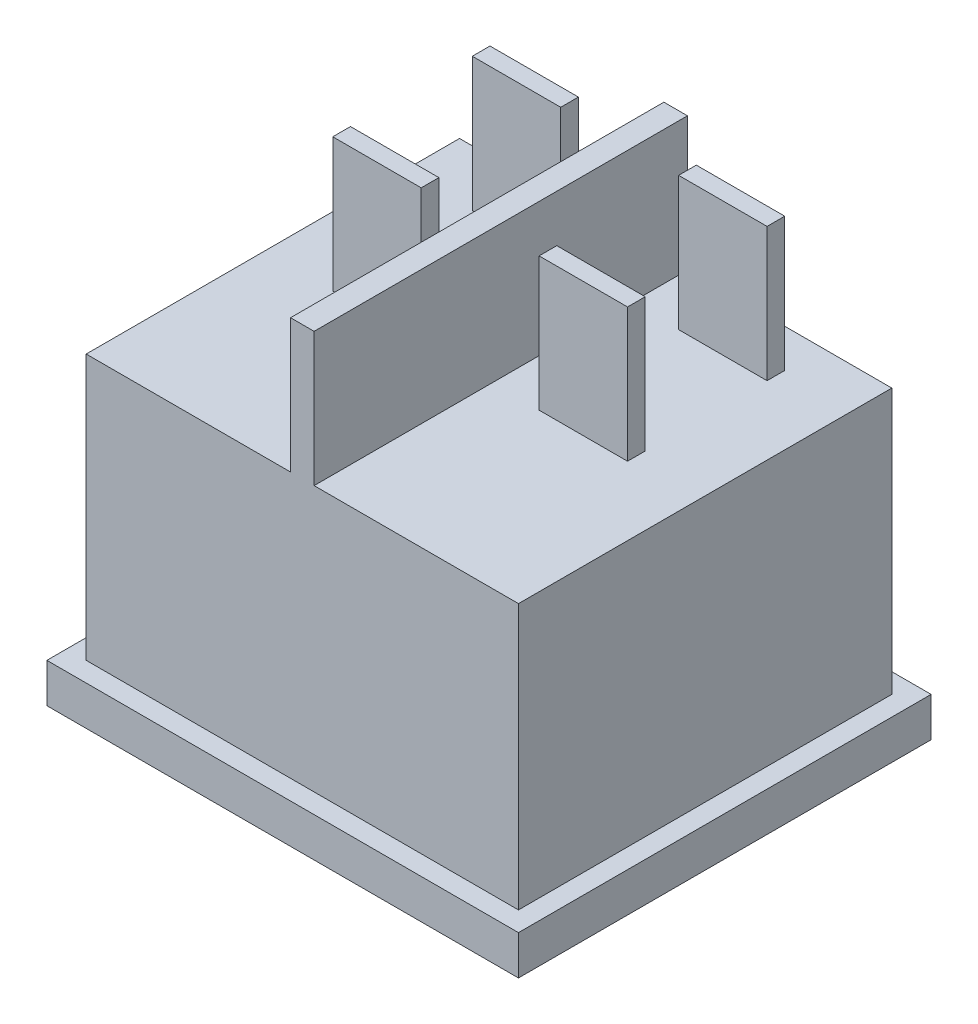
ISO-10303-21;
HEADER;
FILE_DESCRIPTION(('STEP AP214'),'2;1');
FILE_NAME('part.step','',(''),(''),'','','');
FILE_SCHEMA(('AUTOMOTIVE_DESIGN { 1 0 10303 214 1 1 1 1 }'));
ENDSEC;
DATA;
#1=APPLICATION_CONTEXT('core data for automotive mechanical design processes');
#2=APPLICATION_PROTOCOL_DEFINITION('international standard','automotive_design',2000,#1);
#3=PRODUCT_CONTEXT('',#1,'mechanical');
#4=PRODUCT('Part','Part','',(#3));
#5=PRODUCT_RELATED_PRODUCT_CATEGORY('part','',(#4));
#6=PRODUCT_DEFINITION_FORMATION('','',#4);
#7=PRODUCT_DEFINITION_CONTEXT('part definition',#1,'design');
#8=PRODUCT_DEFINITION('design','',#6,#7);
#9=PRODUCT_DEFINITION_SHAPE('','',#8);
#10=(LENGTH_UNIT() NAMED_UNIT(*) SI_UNIT(.MILLI.,.METRE.));
#11=(NAMED_UNIT(*) PLANE_ANGLE_UNIT() SI_UNIT($,.RADIAN.));
#12=(NAMED_UNIT(*) SI_UNIT($,.STERADIAN.) SOLID_ANGLE_UNIT());
#13=UNCERTAINTY_MEASURE_WITH_UNIT(LENGTH_MEASURE(1.E-05),#10,'distance_accuracy_value','');
#14=(GEOMETRIC_REPRESENTATION_CONTEXT(3) GLOBAL_UNCERTAINTY_ASSIGNED_CONTEXT((#13)) GLOBAL_UNIT_ASSIGNED_CONTEXT((#10,
#11,#12)) REPRESENTATION_CONTEXT('',''));
#15=CARTESIAN_POINT('',(0.,0.,0.));
#16=DIRECTION('',(0.,0.,1.));
#17=DIRECTION('',(1.,0.,0.));
#18=AXIS2_PLACEMENT_3D('',#15,#16,#17);
#19=CARTESIAN_POINT('',(0.,15.5,0.));
#20=DIRECTION('',(0.,-1.,0.));
#21=DIRECTION('',(0.,0.,-1.));
#22=AXIS2_PLACEMENT_3D('',#19,#20,#21);
#23=PLANE('',#22);
#24=DIRECTION('',(1.,0.,0.));
#25=VECTOR('',#24,1.);
#26=CARTESIAN_POINT('',(3.,15.5,-6.65));
#27=LINE('',#26,#25);
#28=CARTESIAN_POINT('',(3.,15.5,-6.65));
#29=VERTEX_POINT('',#28);
#30=CARTESIAN_POINT('',(7.5,15.5,-6.65));
#31=VERTEX_POINT('',#30);
#32=EDGE_CURVE('E272',#29,#31,#27,.T.);
#33=ORIENTED_EDGE('',*,*,#32,.F.);
#34=DIRECTION('',(0.,0.,1.));
#35=VECTOR('',#34,1.);
#36=CARTESIAN_POINT('',(3.,15.5,-6.65));
#37=LINE('',#36,#35);
#38=CARTESIAN_POINT('',(3.,15.5,-7.55));
#39=VERTEX_POINT('',#38);
#40=EDGE_CURVE('E269',#39,#29,#37,.T.);
#41=ORIENTED_EDGE('',*,*,#40,.F.);
#42=DIRECTION('',(-1.,0.,0.));
#43=VECTOR('',#42,1.);
#44=CARTESIAN_POINT('',(3.,15.5,-7.55));
#45=LINE('',#44,#43);
#46=CARTESIAN_POINT('',(7.5,15.5,-7.55));
#47=VERTEX_POINT('',#46);
#48=EDGE_CURVE('E266',#47,#39,#45,.T.);
#49=ORIENTED_EDGE('',*,*,#48,.F.);
#50=DIRECTION('',(0.,0.,-1.));
#51=VECTOR('',#50,1.);
#52=CARTESIAN_POINT('',(7.5,15.5,-6.65));
#53=LINE('',#52,#51);
#54=EDGE_CURVE('E263',#31,#47,#53,.T.);
#55=ORIENTED_EDGE('',*,*,#54,.F.);
#56=EDGE_LOOP('',(#33,#41,#49,#55));
#57=FACE_BOUND('',#56,.T.);
#58=DIRECTION('',(0.,0.,-1.));
#59=VECTOR('',#58,1.);
#60=CARTESIAN_POINT('',(0.6,15.5,9.5));
#61=LINE('',#60,#59);
#62=CARTESIAN_POINT('',(0.6,15.5,9.5));
#63=VERTEX_POINT('',#62);
#64=CARTESIAN_POINT('',(0.6,15.5,-9.5));
#65=VERTEX_POINT('',#64);
#66=EDGE_CURVE('E335',#63,#65,#61,.T.);
#67=ORIENTED_EDGE('',*,*,#66,.F.);
#68=DIRECTION('',(1.,0.,0.));
#69=VECTOR('',#68,1.);
#70=CARTESIAN_POINT('',(-11.,15.5,9.5));
#71=LINE('',#70,#69);
#72=CARTESIAN_POINT('',(11.,15.5,9.5));
#73=VERTEX_POINT('',#72);
#74=EDGE_CURVE('E397',#63,#73,#71,.T.);
#75=ORIENTED_EDGE('',*,*,#74,.T.);
#76=DIRECTION('',(0.,0.,-1.));
#77=VECTOR('',#76,1.);
#78=CARTESIAN_POINT('',(11.,15.5,9.5));
#79=LINE('',#78,#77);
#80=CARTESIAN_POINT('',(11.,15.5,-9.5));
#81=VERTEX_POINT('',#80);
#82=EDGE_CURVE('E388',#73,#81,#79,.T.);
#83=ORIENTED_EDGE('',*,*,#82,.T.);
#84=DIRECTION('',(-1.,0.,0.));
#85=VECTOR('',#84,1.);
#86=CARTESIAN_POINT('',(-11.,15.5,-9.5));
#87=LINE('',#86,#85);
#88=EDGE_CURVE('E393',#81,#65,#87,.T.);
#89=ORIENTED_EDGE('',*,*,#88,.T.);
#90=EDGE_LOOP('',(#67,#75,#83,#89));
#91=FACE_BOUND('',#90,.T.);
#92=DIRECTION('',(1.,0.,0.));
#93=VECTOR('',#92,1.);
#94=CARTESIAN_POINT('',(3.,15.5,0.45));
#95=LINE('',#94,#93);
#96=CARTESIAN_POINT('',(3.,15.5,0.45));
#97=VERTEX_POINT('',#96);
#98=CARTESIAN_POINT('',(7.5,15.5,0.45));
#99=VERTEX_POINT('',#98);
#100=EDGE_CURVE('E50',#97,#99,#95,.T.);
#101=ORIENTED_EDGE('',*,*,#100,.F.);
#102=DIRECTION('',(0.,0.,1.));
#103=VECTOR('',#102,1.);
#104=CARTESIAN_POINT('',(3.,15.5,0.45));
#105=LINE('',#104,#103);
#106=CARTESIAN_POINT('',(3.,15.5,-0.45));
#107=VERTEX_POINT('',#106);
#108=EDGE_CURVE('E55',#107,#97,#105,.T.);
#109=ORIENTED_EDGE('',*,*,#108,.F.);
#110=DIRECTION('',(-1.,0.,0.));
#111=VECTOR('',#110,1.);
#112=CARTESIAN_POINT('',(3.,15.5,-0.45));
#113=LINE('',#112,#111);
#114=CARTESIAN_POINT('',(7.5,15.5,-0.45));
#115=VERTEX_POINT('',#114);
#116=EDGE_CURVE('E217',#115,#107,#113,.T.);
#117=ORIENTED_EDGE('',*,*,#116,.F.);
#118=DIRECTION('',(0.,0.,-1.));
#119=VECTOR('',#118,1.);
#120=CARTESIAN_POINT('',(7.5,15.5,0.45));
#121=LINE('',#120,#119);
#122=EDGE_CURVE('E220',#99,#115,#121,.T.);
#123=ORIENTED_EDGE('',*,*,#122,.F.);
#124=EDGE_LOOP('',(#101,#109,#117,#123));
#125=FACE_BOUND('',#124,.T.);
#126=ADVANCED_FACE('F35',(#57,#91,#125),#23,.F.);
#127=DIRECTION('',(1.,0.,0.));
#128=VECTOR('',#127,1.);
#129=CARTESIAN_POINT('',(-7.5,15.5,-6.65));
#130=LINE('',#129,#128);
#131=CARTESIAN_POINT('',(-7.5,15.5,-6.65));
#132=VERTEX_POINT('',#131);
#133=CARTESIAN_POINT('',(-3.,15.5,-6.65));
#134=VERTEX_POINT('',#133);
#135=EDGE_CURVE('E344',#132,#134,#130,.T.);
#136=ORIENTED_EDGE('',*,*,#135,.F.);
#137=DIRECTION('',(0.,0.,1.));
#138=VECTOR('',#137,1.);
#139=CARTESIAN_POINT('',(-7.5,15.5,-6.65));
#140=LINE('',#139,#138);
#141=CARTESIAN_POINT('',(-7.5,15.5,-7.55));
#142=VERTEX_POINT('',#141);
#143=EDGE_CURVE('E341',#142,#132,#140,.T.);
#144=ORIENTED_EDGE('',*,*,#143,.F.);
#145=DIRECTION('',(-1.,0.,0.));
#146=VECTOR('',#145,1.);
#147=CARTESIAN_POINT('',(-7.5,15.5,-7.55));
#148=LINE('',#147,#146);
#149=CARTESIAN_POINT('',(-3.,15.5,-7.55));
#150=VERTEX_POINT('',#149);
#151=EDGE_CURVE('E338',#150,#142,#148,.T.);
#152=ORIENTED_EDGE('',*,*,#151,.F.);
#153=DIRECTION('',(0.,0.,-1.));
#154=VECTOR('',#153,1.);
#155=CARTESIAN_POINT('',(-3.,15.5,-6.65));
#156=LINE('',#155,#154);
#157=EDGE_CURVE('E299',#134,#150,#156,.T.);
#158=ORIENTED_EDGE('',*,*,#157,.F.);
#159=EDGE_LOOP('',(#136,#144,#152,#158));
#160=FACE_BOUND('',#159,.T.);
#161=DIRECTION('',(0.,0.,1.));
#162=VECTOR('',#161,1.);
#163=CARTESIAN_POINT('',(-0.6,15.5,9.5));
#164=LINE('',#163,#162);
#165=CARTESIAN_POINT('',(-0.6,15.5,-9.5));
#166=VERTEX_POINT('',#165);
#167=CARTESIAN_POINT('',(-0.6,15.5,9.5));
#168=VERTEX_POINT('',#167);
#169=EDGE_CURVE('E365',#166,#168,#164,.T.);
#170=ORIENTED_EDGE('',*,*,#169,.F.);
#171=CARTESIAN_POINT('',(-11.,15.5,-9.5));
#172=VERTEX_POINT('',#171);
#173=EDGE_CURVE('E391',#166,#172,#87,.T.);
#174=ORIENTED_EDGE('',*,*,#173,.T.);
#175=DIRECTION('',(0.,0.,1.));
#176=VECTOR('',#175,1.);
#177=CARTESIAN_POINT('',(-11.,15.5,9.5));
#178=LINE('',#177,#176);
#179=CARTESIAN_POINT('',(-11.,15.5,9.5));
#180=VERTEX_POINT('',#179);
#181=EDGE_CURVE('E395',#172,#180,#178,.T.);
#182=ORIENTED_EDGE('',*,*,#181,.T.);
#183=EDGE_CURVE('E398',#180,#168,#71,.T.);
#184=ORIENTED_EDGE('',*,*,#183,.T.);
#185=EDGE_LOOP('',(#170,#174,#182,#184));
#186=FACE_BOUND('',#185,.T.);
#187=DIRECTION('',(1.,0.,0.));
#188=VECTOR('',#187,1.);
#189=CARTESIAN_POINT('',(-7.5,15.5,0.45));
#190=LINE('',#189,#188);
#191=CARTESIAN_POINT('',(-7.5,15.5,0.45));
#192=VERTEX_POINT('',#191);
#193=CARTESIAN_POINT('',(-3.,15.5,0.45));
#194=VERTEX_POINT('',#193);
#195=EDGE_CURVE('E308',#192,#194,#190,.T.);
#196=ORIENTED_EDGE('',*,*,#195,.F.);
#197=DIRECTION('',(0.,0.,1.));
#198=VECTOR('',#197,1.);
#199=CARTESIAN_POINT('',(-7.5,15.5,0.45));
#200=LINE('',#199,#198);
#201=CARTESIAN_POINT('',(-7.5,15.5,-0.45));
#202=VERTEX_POINT('',#201);
#203=EDGE_CURVE('E305',#202,#192,#200,.T.);
#204=ORIENTED_EDGE('',*,*,#203,.F.);
#205=DIRECTION('',(-1.,0.,0.));
#206=VECTOR('',#205,1.);
#207=CARTESIAN_POINT('',(-7.5,15.5,-0.45));
#208=LINE('',#207,#206);
#209=CARTESIAN_POINT('',(-3.,15.5,-0.45));
#210=VERTEX_POINT('',#209);
#211=EDGE_CURVE('E302',#210,#202,#208,.T.);
#212=ORIENTED_EDGE('',*,*,#211,.F.);
#213=DIRECTION('',(0.,0.,-1.));
#214=VECTOR('',#213,1.);
#215=CARTESIAN_POINT('',(-3.,15.5,0.45));
#216=LINE('',#215,#214);
#217=EDGE_CURVE('E262',#194,#210,#216,.T.);
#218=ORIENTED_EDGE('',*,*,#217,.F.);
#219=EDGE_LOOP('',(#196,#204,#212,#218));
#220=FACE_BOUND('',#219,.T.);
#221=ADVANCED_FACE('F475',(#160,#186,#220),#23,.F.);
#222=CARTESIAN_POINT('',(0.,2.,0.));
#223=DIRECTION('',(0.,-1.,0.));
#224=DIRECTION('',(0.,0.,-1.));
#225=AXIS2_PLACEMENT_3D('',#222,#223,#224);
#226=PLANE('',#225);
#227=DIRECTION('',(0.,0.,-1.));
#228=VECTOR('',#227,1.);
#229=CARTESIAN_POINT('',(12.,2.,10.5));
#230=LINE('',#229,#228);
#231=CARTESIAN_POINT('',(12.,2.,10.5));
#232=VERTEX_POINT('',#231);
#233=CARTESIAN_POINT('',(12.,2.,-10.5));
#234=VERTEX_POINT('',#233);
#235=EDGE_CURVE('E423',#232,#234,#230,.T.);
#236=ORIENTED_EDGE('',*,*,#235,.T.);
#237=DIRECTION('',(-1.,0.,0.));
#238=VECTOR('',#237,1.);
#239=CARTESIAN_POINT('',(-12.,2.,-10.5));
#240=LINE('',#239,#238);
#241=CARTESIAN_POINT('',(-12.,2.,-10.5));
#242=VERTEX_POINT('',#241);
#243=EDGE_CURVE('E426',#234,#242,#240,.T.);
#244=ORIENTED_EDGE('',*,*,#243,.T.);
#245=DIRECTION('',(0.,0.,1.));
#246=VECTOR('',#245,1.);
#247=CARTESIAN_POINT('',(-12.,2.,10.5));
#248=LINE('',#247,#246);
#249=CARTESIAN_POINT('',(-12.,2.,10.5));
#250=VERTEX_POINT('',#249);
#251=EDGE_CURVE('E429',#242,#250,#248,.T.);
#252=ORIENTED_EDGE('',*,*,#251,.T.);
#253=DIRECTION('',(1.,0.,0.));
#254=VECTOR('',#253,1.);
#255=CARTESIAN_POINT('',(-12.,2.,10.5));
#256=LINE('',#255,#254);
#257=EDGE_CURVE('E431',#250,#232,#256,.T.);
#258=ORIENTED_EDGE('',*,*,#257,.T.);
#259=EDGE_LOOP('',(#236,#244,#252,#258));
#260=FACE_BOUND('',#259,.T.);
#261=DIRECTION('',(0.,0.,-1.));
#262=VECTOR('',#261,1.);
#263=CARTESIAN_POINT('',(11.,2.,9.5));
#264=LINE('',#263,#262);
#265=CARTESIAN_POINT('',(11.,2.,9.5));
#266=VERTEX_POINT('',#265);
#267=CARTESIAN_POINT('',(11.,2.,-9.5));
#268=VERTEX_POINT('',#267);
#269=EDGE_CURVE('E387',#266,#268,#264,.T.);
#270=ORIENTED_EDGE('',*,*,#269,.F.);
#271=DIRECTION('',(1.,0.,0.));
#272=VECTOR('',#271,1.);
#273=CARTESIAN_POINT('',(-11.,2.,9.5));
#274=LINE('',#273,#272);
#275=CARTESIAN_POINT('',(-11.,2.,9.5));
#276=VERTEX_POINT('',#275);
#277=EDGE_CURVE('E392',#276,#266,#274,.T.);
#278=ORIENTED_EDGE('',*,*,#277,.F.);
#279=DIRECTION('',(0.,0.,1.));
#280=VECTOR('',#279,1.);
#281=CARTESIAN_POINT('',(-11.,2.,9.5));
#282=LINE('',#281,#280);
#283=CARTESIAN_POINT('',(-11.,2.,-9.5));
#284=VERTEX_POINT('',#283);
#285=EDGE_CURVE('E406',#284,#276,#282,.T.);
#286=ORIENTED_EDGE('',*,*,#285,.F.);
#287=DIRECTION('',(-1.,0.,0.));
#288=VECTOR('',#287,1.);
#289=CARTESIAN_POINT('',(-11.,2.,-9.5));
#290=LINE('',#289,#288);
#291=EDGE_CURVE('E403',#268,#284,#290,.T.);
#292=ORIENTED_EDGE('',*,*,#291,.F.);
#293=EDGE_LOOP('',(#270,#278,#286,#292));
#294=FACE_BOUND('',#293,.T.);
#295=ADVANCED_FACE('F465',(#260,#294),#226,.F.);
#296=CARTESIAN_POINT('',(12.,2.,10.5));
#297=DIRECTION('',(-1.,0.,0.));
#298=DIRECTION('',(0.,0.,1.));
#299=AXIS2_PLACEMENT_3D('',#296,#297,#298);
#300=PLANE('',#299);
#301=DIRECTION('',(0.,0.,-1.));
#302=VECTOR('',#301,1.);
#303=CARTESIAN_POINT('',(12.,0.,10.5));
#304=LINE('',#303,#302);
#305=CARTESIAN_POINT('',(12.,0.,10.5));
#306=VERTEX_POINT('',#305);
#307=CARTESIAN_POINT('',(12.,0.,-10.5));
#308=VERTEX_POINT('',#307);
#309=EDGE_CURVE('E422',#306,#308,#304,.T.);
#310=ORIENTED_EDGE('',*,*,#309,.T.);
#311=DIRECTION('',(0.,-1.,0.));
#312=VECTOR('',#311,1.);
#313=CARTESIAN_POINT('',(12.,2.,-10.5));
#314=LINE('',#313,#312);
#315=EDGE_CURVE('E11',#234,#308,#314,.T.);
#316=ORIENTED_EDGE('',*,*,#315,.F.);
#317=ORIENTED_EDGE('',*,*,#235,.F.);
#318=DIRECTION('',(0.,-1.,0.));
#319=VECTOR('',#318,1.);
#320=CARTESIAN_POINT('',(12.,2.,10.5));
#321=LINE('',#320,#319);
#322=EDGE_CURVE('E433',#232,#306,#321,.T.);
#323=ORIENTED_EDGE('',*,*,#322,.T.);
#324=EDGE_LOOP('',(#310,#316,#317,#323));
#325=FACE_BOUND('',#324,.T.);
#326=ADVANCED_FACE('F37',(#325),#300,.F.);
#327=CARTESIAN_POINT('',(-12.,2.,-10.5));
#328=DIRECTION('',(0.,0.,1.));
#329=DIRECTION('',(1.,0.,0.));
#330=AXIS2_PLACEMENT_3D('',#327,#328,#329);
#331=PLANE('',#330);
#332=DIRECTION('',(-1.,0.,0.));
#333=VECTOR('',#332,1.);
#334=CARTESIAN_POINT('',(-12.,0.,-10.5));
#335=LINE('',#334,#333);
#336=CARTESIAN_POINT('',(-12.,0.,-10.5));
#337=VERTEX_POINT('',#336);
#338=EDGE_CURVE('E436',#308,#337,#335,.T.);
#339=ORIENTED_EDGE('',*,*,#338,.T.);
#340=DIRECTION('',(0.,-1.,0.));
#341=VECTOR('',#340,1.);
#342=CARTESIAN_POINT('',(-12.,2.,-10.5));
#343=LINE('',#342,#341);
#344=EDGE_CURVE('E43',#242,#337,#343,.T.);
#345=ORIENTED_EDGE('',*,*,#344,.F.);
#346=ORIENTED_EDGE('',*,*,#243,.F.);
#347=ORIENTED_EDGE('',*,*,#315,.T.);
#348=EDGE_LOOP('',(#339,#345,#346,#347));
#349=FACE_BOUND('',#348,.T.);
#350=ADVANCED_FACE('F467',(#349),#331,.F.);
#351=CARTESIAN_POINT('',(-12.,2.,10.5));
#352=DIRECTION('',(1.,0.,0.));
#353=DIRECTION('',(0.,0.,-1.));
#354=AXIS2_PLACEMENT_3D('',#351,#352,#353);
#355=PLANE('',#354);
#356=DIRECTION('',(0.,0.,1.));
#357=VECTOR('',#356,1.);
#358=CARTESIAN_POINT('',(-12.,0.,10.5));
#359=LINE('',#358,#357);
#360=CARTESIAN_POINT('',(-12.,0.,10.5));
#361=VERTEX_POINT('',#360);
#362=EDGE_CURVE('E438',#337,#361,#359,.T.);
#363=ORIENTED_EDGE('',*,*,#362,.T.);
#364=DIRECTION('',(0.,-1.,0.));
#365=VECTOR('',#364,1.);
#366=CARTESIAN_POINT('',(-12.,2.,10.5));
#367=LINE('',#366,#365);
#368=EDGE_CURVE('E443',#250,#361,#367,.T.);
#369=ORIENTED_EDGE('',*,*,#368,.F.);
#370=ORIENTED_EDGE('',*,*,#251,.F.);
#371=ORIENTED_EDGE('',*,*,#344,.T.);
#372=EDGE_LOOP('',(#363,#369,#370,#371));
#373=FACE_BOUND('',#372,.T.);
#374=ADVANCED_FACE('F450',(#373),#355,.F.);
#375=CARTESIAN_POINT('',(-12.,2.,10.5));
#376=DIRECTION('',(0.,0.,-1.));
#377=DIRECTION('',(-1.,0.,0.));
#378=AXIS2_PLACEMENT_3D('',#375,#376,#377);
#379=PLANE('',#378);
#380=DIRECTION('',(1.,0.,0.));
#381=VECTOR('',#380,1.);
#382=CARTESIAN_POINT('',(-12.,0.,10.5));
#383=LINE('',#382,#381);
#384=EDGE_CURVE('E427',#361,#306,#383,.T.);
#385=ORIENTED_EDGE('',*,*,#384,.T.);
#386=ORIENTED_EDGE('',*,*,#322,.F.);
#387=ORIENTED_EDGE('',*,*,#257,.F.);
#388=ORIENTED_EDGE('',*,*,#368,.T.);
#389=EDGE_LOOP('',(#385,#386,#387,#388));
#390=FACE_BOUND('',#389,.T.);
#391=ADVANCED_FACE('F459',(#390),#379,.F.);
#392=CARTESIAN_POINT('',(0.,0.,0.));
#393=DIRECTION('',(0.,-1.,0.));
#394=DIRECTION('',(0.,0.,-1.));
#395=AXIS2_PLACEMENT_3D('',#392,#393,#394);
#396=PLANE('',#395);
#397=ORIENTED_EDGE('',*,*,#309,.F.);
#398=ORIENTED_EDGE('',*,*,#384,.F.);
#399=ORIENTED_EDGE('',*,*,#362,.F.);
#400=ORIENTED_EDGE('',*,*,#338,.F.);
#401=EDGE_LOOP('',(#397,#398,#399,#400));
#402=FACE_BOUND('',#401,.T.);
#403=ADVANCED_FACE('F456',(#402),#396,.T.);
#404=CARTESIAN_POINT('',(11.,15.5,9.5));
#405=DIRECTION('',(-1.,0.,0.));
#406=DIRECTION('',(0.,0.,1.));
#407=AXIS2_PLACEMENT_3D('',#404,#405,#406);
#408=PLANE('',#407);
#409=ORIENTED_EDGE('',*,*,#269,.T.);
#410=DIRECTION('',(0.,-1.,0.));
#411=VECTOR('',#410,1.);
#412=CARTESIAN_POINT('',(11.,15.5,-9.5));
#413=LINE('',#412,#411);
#414=EDGE_CURVE('E419',#81,#268,#413,.T.);
#415=ORIENTED_EDGE('',*,*,#414,.F.);
#416=ORIENTED_EDGE('',*,*,#82,.F.);
#417=DIRECTION('',(0.,-1.,0.));
#418=VECTOR('',#417,1.);
#419=CARTESIAN_POINT('',(11.,15.5,9.5));
#420=LINE('',#419,#418);
#421=EDGE_CURVE('E400',#73,#266,#420,.T.);
#422=ORIENTED_EDGE('',*,*,#421,.T.);
#423=EDGE_LOOP('',(#409,#415,#416,#422));
#424=FACE_BOUND('',#423,.T.);
#425=ADVANCED_FACE('F498',(#424),#408,.F.);
#426=CARTESIAN_POINT('',(-11.,15.5,-9.5));
#427=DIRECTION('',(0.,0.,1.));
#428=DIRECTION('',(1.,0.,0.));
#429=AXIS2_PLACEMENT_3D('',#426,#427,#428);
#430=PLANE('',#429);
#431=ORIENTED_EDGE('',*,*,#291,.T.);
#432=DIRECTION('',(0.,-1.,0.));
#433=VECTOR('',#432,1.);
#434=CARTESIAN_POINT('',(-11.,15.5,-9.5));
#435=LINE('',#434,#433);
#436=EDGE_CURVE('E416',#172,#284,#435,.T.);
#437=ORIENTED_EDGE('',*,*,#436,.F.);
#438=ORIENTED_EDGE('',*,*,#173,.F.);
#439=DIRECTION('',(0.,-1.,0.));
#440=VECTOR('',#439,1.);
#441=CARTESIAN_POINT('',(-0.6,22.3,-9.5));
#442=LINE('',#441,#440);
#443=CARTESIAN_POINT('',(-0.6,22.3,-9.5));
#444=VERTEX_POINT('',#443);
#445=EDGE_CURVE('E381',#444,#166,#442,.T.);
#446=ORIENTED_EDGE('',*,*,#445,.F.);
#447=DIRECTION('',(-1.,0.,0.));
#448=VECTOR('',#447,1.);
#449=CARTESIAN_POINT('',(-0.6,22.3,-9.5));
#450=LINE('',#449,#448);
#451=CARTESIAN_POINT('',(0.6,22.3,-9.5));
#452=VERTEX_POINT('',#451);
#453=EDGE_CURVE('E364',#452,#444,#450,.T.);
#454=ORIENTED_EDGE('',*,*,#453,.F.);
#455=DIRECTION('',(0.,-1.,0.));
#456=VECTOR('',#455,1.);
#457=CARTESIAN_POINT('',(0.6,22.3,-9.5));
#458=LINE('',#457,#456);
#459=EDGE_CURVE('E384',#452,#65,#458,.T.);
#460=ORIENTED_EDGE('',*,*,#459,.T.);
#461=ORIENTED_EDGE('',*,*,#88,.F.);
#462=ORIENTED_EDGE('',*,*,#414,.T.);
#463=EDGE_LOOP('',(#431,#437,#438,#446,#454,#460,#461,#462));
#464=FACE_BOUND('',#463,.T.);
#465=ADVANCED_FACE('F494',(#464),#430,.F.);
#466=CARTESIAN_POINT('',(-11.,15.5,9.5));
#467=DIRECTION('',(1.,0.,0.));
#468=DIRECTION('',(0.,0.,-1.));
#469=AXIS2_PLACEMENT_3D('',#466,#467,#468);
#470=PLANE('',#469);
#471=ORIENTED_EDGE('',*,*,#285,.T.);
#472=DIRECTION('',(0.,-1.,0.));
#473=VECTOR('',#472,1.);
#474=CARTESIAN_POINT('',(-11.,15.5,9.5));
#475=LINE('',#474,#473);
#476=EDGE_CURVE('E413',#180,#276,#475,.T.);
#477=ORIENTED_EDGE('',*,*,#476,.F.);
#478=ORIENTED_EDGE('',*,*,#181,.F.);
#479=ORIENTED_EDGE('',*,*,#436,.T.);
#480=EDGE_LOOP('',(#471,#477,#478,#479));
#481=FACE_BOUND('',#480,.T.);
#482=ADVANCED_FACE('F490',(#481),#470,.F.);
#483=CARTESIAN_POINT('',(-11.,15.5,9.5));
#484=DIRECTION('',(0.,0.,-1.));
#485=DIRECTION('',(-1.,0.,0.));
#486=AXIS2_PLACEMENT_3D('',#483,#484,#485);
#487=PLANE('',#486);
#488=ORIENTED_EDGE('',*,*,#277,.T.);
#489=ORIENTED_EDGE('',*,*,#421,.F.);
#490=ORIENTED_EDGE('',*,*,#74,.F.);
#491=DIRECTION('',(0.,-1.,0.));
#492=VECTOR('',#491,1.);
#493=CARTESIAN_POINT('',(0.6,22.3,9.5));
#494=LINE('',#493,#492);
#495=CARTESIAN_POINT('',(0.6,22.3,9.5));
#496=VERTEX_POINT('',#495);
#497=EDGE_CURVE('E371',#496,#63,#494,.T.);
#498=ORIENTED_EDGE('',*,*,#497,.F.);
#499=DIRECTION('',(1.,0.,0.));
#500=VECTOR('',#499,1.);
#501=CARTESIAN_POINT('',(-0.6,22.3,9.5));
#502=LINE('',#501,#500);
#503=CARTESIAN_POINT('',(-0.6,22.3,9.5));
#504=VERTEX_POINT('',#503);
#505=EDGE_CURVE('E369',#504,#496,#502,.T.);
#506=ORIENTED_EDGE('',*,*,#505,.F.);
#507=DIRECTION('',(0.,-1.,0.));
#508=VECTOR('',#507,1.);
#509=CARTESIAN_POINT('',(-0.6,22.3,9.5));
#510=LINE('',#509,#508);
#511=EDGE_CURVE('E378',#504,#168,#510,.T.);
#512=ORIENTED_EDGE('',*,*,#511,.T.);
#513=ORIENTED_EDGE('',*,*,#183,.F.);
#514=ORIENTED_EDGE('',*,*,#476,.T.);
#515=EDGE_LOOP('',(#488,#489,#490,#498,#506,#512,#513,#514));
#516=FACE_BOUND('',#515,.T.);
#517=ADVANCED_FACE('F487',(#516),#487,.F.);
#518=CARTESIAN_POINT('',(0.6,22.3,9.5));
#519=DIRECTION('',(-1.,0.,0.));
#520=DIRECTION('',(0.,0.,1.));
#521=AXIS2_PLACEMENT_3D('',#518,#519,#520);
#522=PLANE('',#521);
#523=ORIENTED_EDGE('',*,*,#66,.T.);
#524=ORIENTED_EDGE('',*,*,#459,.F.);
#525=DIRECTION('',(0.,0.,-1.));
#526=VECTOR('',#525,1.);
#527=CARTESIAN_POINT('',(0.6,22.3,9.5));
#528=LINE('',#527,#526);
#529=EDGE_CURVE('E361',#496,#452,#528,.T.);
#530=ORIENTED_EDGE('',*,*,#529,.F.);
#531=ORIENTED_EDGE('',*,*,#497,.T.);
#532=EDGE_LOOP('',(#523,#524,#530,#531));
#533=FACE_BOUND('',#532,.T.);
#534=ADVANCED_FACE('F485',(#533),#522,.F.);
#535=CARTESIAN_POINT('',(-0.6,22.3,9.5));
#536=DIRECTION('',(1.,0.,0.));
#537=DIRECTION('',(0.,0.,-1.));
#538=AXIS2_PLACEMENT_3D('',#535,#536,#537);
#539=PLANE('',#538);
#540=ORIENTED_EDGE('',*,*,#169,.T.);
#541=ORIENTED_EDGE('',*,*,#511,.F.);
#542=DIRECTION('',(0.,0.,1.));
#543=VECTOR('',#542,1.);
#544=CARTESIAN_POINT('',(-0.6,22.3,9.5));
#545=LINE('',#544,#543);
#546=EDGE_CURVE('E367',#444,#504,#545,.T.);
#547=ORIENTED_EDGE('',*,*,#546,.F.);
#548=ORIENTED_EDGE('',*,*,#445,.T.);
#549=EDGE_LOOP('',(#540,#541,#547,#548));
#550=FACE_BOUND('',#549,.T.);
#551=ADVANCED_FACE('F539',(#550),#539,.F.);
#552=CARTESIAN_POINT('',(0.,22.3,0.));
#553=DIRECTION('',(0.,-1.,0.));
#554=DIRECTION('',(0.,0.,-1.));
#555=AXIS2_PLACEMENT_3D('',#552,#553,#554);
#556=PLANE('',#555);
#557=ORIENTED_EDGE('',*,*,#529,.T.);
#558=ORIENTED_EDGE('',*,*,#453,.T.);
#559=ORIENTED_EDGE('',*,*,#546,.T.);
#560=ORIENTED_EDGE('',*,*,#505,.T.);
#561=EDGE_LOOP('',(#557,#558,#559,#560));
#562=FACE_BOUND('',#561,.T.);
#563=ADVANCED_FACE('F546',(#562),#556,.F.);
#564=CARTESIAN_POINT('',(-7.5,26.8891175622335,-6.65));
#565=DIRECTION('',(0.,0.,-1.));
#566=DIRECTION('',(-1.,0.,0.));
#567=AXIS2_PLACEMENT_3D('',#564,#565,#566);
#568=PLANE('',#567);
#569=DIRECTION('',(0.,-1.,0.));
#570=VECTOR('',#569,1.);
#571=CARTESIAN_POINT('',(-3.,26.8891175622335,-6.65));
#572=LINE('',#571,#570);
#573=CARTESIAN_POINT('',(-3.,22.3,-6.65));
#574=VERTEX_POINT('',#573);
#575=EDGE_CURVE('E347',#574,#134,#572,.T.);
#576=ORIENTED_EDGE('',*,*,#575,.F.);
#577=DIRECTION('',(-1.,0.,0.));
#578=VECTOR('',#577,1.);
#579=CARTESIAN_POINT('',(-7.5,22.3,-6.65));
#580=LINE('',#579,#578);
#581=CARTESIAN_POINT('',(-7.5,22.3,-6.65));
#582=VERTEX_POINT('',#581);
#583=EDGE_CURVE('E329',#574,#582,#580,.T.);
#584=ORIENTED_EDGE('',*,*,#583,.T.);
#585=DIRECTION('',(0.,-1.,0.));
#586=VECTOR('',#585,1.);
#587=CARTESIAN_POINT('',(-7.5,26.8891175622335,-6.65));
#588=LINE('',#587,#586);
#589=EDGE_CURVE('E350',#582,#132,#588,.T.);
#590=ORIENTED_EDGE('',*,*,#589,.T.);
#591=ORIENTED_EDGE('',*,*,#135,.T.);
#592=EDGE_LOOP('',(#576,#584,#590,#591));
#593=FACE_BOUND('',#592,.T.);
#594=ADVANCED_FACE('F553',(#593),#568,.F.);
#595=CARTESIAN_POINT('',(-7.5,26.8891175622335,-6.65));
#596=DIRECTION('',(1.,0.,0.));
#597=DIRECTION('',(0.,0.,-1.));
#598=AXIS2_PLACEMENT_3D('',#595,#596,#597);
#599=PLANE('',#598);
#600=ORIENTED_EDGE('',*,*,#589,.F.);
#601=DIRECTION('',(0.,0.,-1.));
#602=VECTOR('',#601,1.);
#603=CARTESIAN_POINT('',(-7.5,22.3,-6.65));
#604=LINE('',#603,#602);
#605=CARTESIAN_POINT('',(-7.5,22.3,-7.55));
#606=VERTEX_POINT('',#605);
#607=EDGE_CURVE('E325',#582,#606,#604,.T.);
#608=ORIENTED_EDGE('',*,*,#607,.T.);
#609=DIRECTION('',(0.,-1.,0.));
#610=VECTOR('',#609,1.);
#611=CARTESIAN_POINT('',(-7.5,26.8891175622335,-7.55));
#612=LINE('',#611,#610);
#613=EDGE_CURVE('E353',#606,#142,#612,.T.);
#614=ORIENTED_EDGE('',*,*,#613,.T.);
#615=ORIENTED_EDGE('',*,*,#143,.T.);
#616=EDGE_LOOP('',(#600,#608,#614,#615));
#617=FACE_BOUND('',#616,.T.);
#618=ADVANCED_FACE('F561',(#617),#599,.F.);
#619=CARTESIAN_POINT('',(-7.5,26.8891175622335,-7.55));
#620=DIRECTION('',(0.,0.,1.));
#621=DIRECTION('',(1.,0.,0.));
#622=AXIS2_PLACEMENT_3D('',#619,#620,#621);
#623=PLANE('',#622);
#624=ORIENTED_EDGE('',*,*,#613,.F.);
#625=DIRECTION('',(1.,0.,0.));
#626=VECTOR('',#625,1.);
#627=CARTESIAN_POINT('',(-7.5,22.3,-7.55));
#628=LINE('',#627,#626);
#629=CARTESIAN_POINT('',(-3.,22.3,-7.55));
#630=VERTEX_POINT('',#629);
#631=EDGE_CURVE('E328',#606,#630,#628,.T.);
#632=ORIENTED_EDGE('',*,*,#631,.T.);
#633=DIRECTION('',(0.,-1.,0.));
#634=VECTOR('',#633,1.);
#635=CARTESIAN_POINT('',(-3.,26.8891175622335,-7.55));
#636=LINE('',#635,#634);
#637=EDGE_CURVE('E356',#630,#150,#636,.T.);
#638=ORIENTED_EDGE('',*,*,#637,.T.);
#639=ORIENTED_EDGE('',*,*,#151,.T.);
#640=EDGE_LOOP('',(#624,#632,#638,#639));
#641=FACE_BOUND('',#640,.T.);
#642=ADVANCED_FACE('F571',(#641),#623,.F.);
#643=CARTESIAN_POINT('',(-3.,26.8891175622335,-6.65));
#644=DIRECTION('',(-1.,0.,0.));
#645=DIRECTION('',(0.,0.,1.));
#646=AXIS2_PLACEMENT_3D('',#643,#644,#645);
#647=PLANE('',#646);
#648=ORIENTED_EDGE('',*,*,#637,.F.);
#649=DIRECTION('',(0.,0.,1.));
#650=VECTOR('',#649,1.);
#651=CARTESIAN_POINT('',(-3.,22.3,-6.65));
#652=LINE('',#651,#650);
#653=EDGE_CURVE('E332',#630,#574,#652,.T.);
#654=ORIENTED_EDGE('',*,*,#653,.T.);
#655=ORIENTED_EDGE('',*,*,#575,.T.);
#656=ORIENTED_EDGE('',*,*,#157,.T.);
#657=EDGE_LOOP('',(#648,#654,#655,#656));
#658=FACE_BOUND('',#657,.T.);
#659=ADVANCED_FACE('F581',(#658),#647,.F.);
#660=CARTESIAN_POINT('',(0.,22.3,0.));
#661=DIRECTION('',(0.,-1.,0.));
#662=DIRECTION('',(0.,0.,-1.));
#663=AXIS2_PLACEMENT_3D('',#660,#661,#662);
#664=PLANE('',#663);
#665=ORIENTED_EDGE('',*,*,#631,.F.);
#666=ORIENTED_EDGE('',*,*,#607,.F.);
#667=ORIENTED_EDGE('',*,*,#583,.F.);
#668=ORIENTED_EDGE('',*,*,#653,.F.);
#669=EDGE_LOOP('',(#665,#666,#667,#668));
#670=FACE_BOUND('',#669,.T.);
#671=ADVANCED_FACE('F589',(#670),#664,.F.);
#672=CARTESIAN_POINT('',(-7.5,26.8891175622335,0.45));
#673=DIRECTION('',(0.,0.,-1.));
#674=DIRECTION('',(-1.,0.,0.));
#675=AXIS2_PLACEMENT_3D('',#672,#673,#674);
#676=PLANE('',#675);
#677=DIRECTION('',(0.,-1.,0.));
#678=VECTOR('',#677,1.);
#679=CARTESIAN_POINT('',(-3.,26.8891175622335,0.45));
#680=LINE('',#679,#678);
#681=CARTESIAN_POINT('',(-3.,22.3,0.45));
#682=VERTEX_POINT('',#681);
#683=EDGE_CURVE('E311',#682,#194,#680,.T.);
#684=ORIENTED_EDGE('',*,*,#683,.F.);
#685=DIRECTION('',(-1.,0.,0.));
#686=VECTOR('',#685,1.);
#687=CARTESIAN_POINT('',(-7.5,22.3,0.45));
#688=LINE('',#687,#686);
#689=CARTESIAN_POINT('',(-7.5,22.3,0.45));
#690=VERTEX_POINT('',#689);
#691=EDGE_CURVE('E293',#682,#690,#688,.T.);
#692=ORIENTED_EDGE('',*,*,#691,.T.);
#693=DIRECTION('',(0.,-1.,0.));
#694=VECTOR('',#693,1.);
#695=CARTESIAN_POINT('',(-7.5,26.8891175622335,0.45));
#696=LINE('',#695,#694);
#697=EDGE_CURVE('E314',#690,#192,#696,.T.);
#698=ORIENTED_EDGE('',*,*,#697,.T.);
#699=ORIENTED_EDGE('',*,*,#195,.T.);
#700=EDGE_LOOP('',(#684,#692,#698,#699));
#701=FACE_BOUND('',#700,.T.);
#702=ADVANCED_FACE('F597',(#701),#676,.F.);
#703=CARTESIAN_POINT('',(-7.5,26.8891175622335,0.45));
#704=DIRECTION('',(1.,0.,0.));
#705=DIRECTION('',(0.,0.,-1.));
#706=AXIS2_PLACEMENT_3D('',#703,#704,#705);
#707=PLANE('',#706);
#708=ORIENTED_EDGE('',*,*,#697,.F.);
#709=DIRECTION('',(0.,0.,-1.));
#710=VECTOR('',#709,1.);
#711=CARTESIAN_POINT('',(-7.5,22.3,0.45));
#712=LINE('',#711,#710);
#713=CARTESIAN_POINT('',(-7.5,22.3,-0.449999999999999));
#714=VERTEX_POINT('',#713);
#715=EDGE_CURVE('E289',#690,#714,#712,.T.);
#716=ORIENTED_EDGE('',*,*,#715,.T.);
#717=DIRECTION('',(0.,-1.,0.));
#718=VECTOR('',#717,1.);
#719=CARTESIAN_POINT('',(-7.5,26.8891175622335,-0.45));
#720=LINE('',#719,#718);
#721=EDGE_CURVE('E317',#714,#202,#720,.T.);
#722=ORIENTED_EDGE('',*,*,#721,.T.);
#723=ORIENTED_EDGE('',*,*,#203,.T.);
#724=EDGE_LOOP('',(#708,#716,#722,#723));
#725=FACE_BOUND('',#724,.T.);
#726=ADVANCED_FACE('F604',(#725),#707,.F.);
#727=CARTESIAN_POINT('',(-7.5,26.8891175622335,-0.45));
#728=DIRECTION('',(0.,0.,1.));
#729=DIRECTION('',(1.,0.,0.));
#730=AXIS2_PLACEMENT_3D('',#727,#728,#729);
#731=PLANE('',#730);
#732=ORIENTED_EDGE('',*,*,#721,.F.);
#733=DIRECTION('',(1.,0.,0.));
#734=VECTOR('',#733,1.);
#735=CARTESIAN_POINT('',(-7.5,22.3,-0.45));
#736=LINE('',#735,#734);
#737=CARTESIAN_POINT('',(-3.,22.3,-0.45));
#738=VERTEX_POINT('',#737);
#739=EDGE_CURVE('E292',#714,#738,#736,.T.);
#740=ORIENTED_EDGE('',*,*,#739,.T.);
#741=DIRECTION('',(0.,-1.,0.));
#742=VECTOR('',#741,1.);
#743=CARTESIAN_POINT('',(-3.,26.8891175622335,-0.45));
#744=LINE('',#743,#742);
#745=EDGE_CURVE('E320',#738,#210,#744,.T.);
#746=ORIENTED_EDGE('',*,*,#745,.T.);
#747=ORIENTED_EDGE('',*,*,#211,.T.);
#748=EDGE_LOOP('',(#732,#740,#746,#747));
#749=FACE_BOUND('',#748,.T.);
#750=ADVANCED_FACE('F611',(#749),#731,.F.);
#751=CARTESIAN_POINT('',(-3.,26.8891175622335,0.45));
#752=DIRECTION('',(-1.,0.,0.));
#753=DIRECTION('',(0.,0.,1.));
#754=AXIS2_PLACEMENT_3D('',#751,#752,#753);
#755=PLANE('',#754);
#756=ORIENTED_EDGE('',*,*,#745,.F.);
#757=DIRECTION('',(0.,0.,1.));
#758=VECTOR('',#757,1.);
#759=CARTESIAN_POINT('',(-3.,22.3,0.45));
#760=LINE('',#759,#758);
#761=EDGE_CURVE('E296',#738,#682,#760,.T.);
#762=ORIENTED_EDGE('',*,*,#761,.T.);
#763=ORIENTED_EDGE('',*,*,#683,.T.);
#764=ORIENTED_EDGE('',*,*,#217,.T.);
#765=EDGE_LOOP('',(#756,#762,#763,#764));
#766=FACE_BOUND('',#765,.T.);
#767=ADVANCED_FACE('F619',(#766),#755,.F.);
#768=CARTESIAN_POINT('',(0.,22.3,0.));
#769=DIRECTION('',(0.,-1.,0.));
#770=DIRECTION('',(0.,0.,-1.));
#771=AXIS2_PLACEMENT_3D('',#768,#769,#770);
#772=PLANE('',#771);
#773=ORIENTED_EDGE('',*,*,#739,.F.);
#774=ORIENTED_EDGE('',*,*,#715,.F.);
#775=ORIENTED_EDGE('',*,*,#691,.F.);
#776=ORIENTED_EDGE('',*,*,#761,.F.);
#777=EDGE_LOOP('',(#773,#774,#775,#776));
#778=FACE_BOUND('',#777,.T.);
#779=ADVANCED_FACE('F628',(#778),#772,.F.);
#780=CARTESIAN_POINT('',(3.,26.8891175622335,-6.65));
#781=DIRECTION('',(0.,0.,-1.));
#782=DIRECTION('',(-1.,0.,0.));
#783=AXIS2_PLACEMENT_3D('',#780,#781,#782);
#784=PLANE('',#783);
#785=DIRECTION('',(0.,-1.,0.));
#786=VECTOR('',#785,1.);
#787=CARTESIAN_POINT('',(7.5,26.8891175622335,-6.65));
#788=LINE('',#787,#786);
#789=CARTESIAN_POINT('',(7.5,22.3,-6.65));
#790=VERTEX_POINT('',#789);
#791=EDGE_CURVE('E275',#790,#31,#788,.T.);
#792=ORIENTED_EDGE('',*,*,#791,.F.);
#793=DIRECTION('',(-1.,0.,0.));
#794=VECTOR('',#793,1.);
#795=CARTESIAN_POINT('',(3.,22.3,-6.65));
#796=LINE('',#795,#794);
#797=CARTESIAN_POINT('',(3.,22.3,-6.65));
#798=VERTEX_POINT('',#797);
#799=EDGE_CURVE('E256',#790,#798,#796,.T.);
#800=ORIENTED_EDGE('',*,*,#799,.T.);
#801=DIRECTION('',(0.,-1.,0.));
#802=VECTOR('',#801,1.);
#803=CARTESIAN_POINT('',(3.,26.8891175622335,-6.65));
#804=LINE('',#803,#802);
#805=EDGE_CURVE('E278',#798,#29,#804,.T.);
#806=ORIENTED_EDGE('',*,*,#805,.T.);
#807=ORIENTED_EDGE('',*,*,#32,.T.);
#808=EDGE_LOOP('',(#792,#800,#806,#807));
#809=FACE_BOUND('',#808,.T.);
#810=ADVANCED_FACE('F637',(#809),#784,.F.);
#811=CARTESIAN_POINT('',(3.,26.8891175622335,-6.65));
#812=DIRECTION('',(1.,0.,0.));
#813=DIRECTION('',(0.,0.,-1.));
#814=AXIS2_PLACEMENT_3D('',#811,#812,#813);
#815=PLANE('',#814);
#816=ORIENTED_EDGE('',*,*,#805,.F.);
#817=DIRECTION('',(0.,0.,-1.));
#818=VECTOR('',#817,1.);
#819=CARTESIAN_POINT('',(3.,22.3,-6.65));
#820=LINE('',#819,#818);
#821=CARTESIAN_POINT('',(3.,22.3,-7.55));
#822=VERTEX_POINT('',#821);
#823=EDGE_CURVE('E252',#798,#822,#820,.T.);
#824=ORIENTED_EDGE('',*,*,#823,.T.);
#825=DIRECTION('',(0.,-1.,0.));
#826=VECTOR('',#825,1.);
#827=CARTESIAN_POINT('',(3.,26.8891175622335,-7.55));
#828=LINE('',#827,#826);
#829=EDGE_CURVE('E281',#822,#39,#828,.T.);
#830=ORIENTED_EDGE('',*,*,#829,.T.);
#831=ORIENTED_EDGE('',*,*,#40,.T.);
#832=EDGE_LOOP('',(#816,#824,#830,#831));
#833=FACE_BOUND('',#832,.T.);
#834=ADVANCED_FACE('F646',(#833),#815,.F.);
#835=CARTESIAN_POINT('',(3.,26.8891175622335,-7.55));
#836=DIRECTION('',(0.,0.,1.));
#837=DIRECTION('',(1.,0.,0.));
#838=AXIS2_PLACEMENT_3D('',#835,#836,#837);
#839=PLANE('',#838);
#840=ORIENTED_EDGE('',*,*,#829,.F.);
#841=DIRECTION('',(1.,0.,0.));
#842=VECTOR('',#841,1.);
#843=CARTESIAN_POINT('',(3.,22.3,-7.55));
#844=LINE('',#843,#842);
#845=CARTESIAN_POINT('',(7.5,22.3,-7.55));
#846=VERTEX_POINT('',#845);
#847=EDGE_CURVE('E255',#822,#846,#844,.T.);
#848=ORIENTED_EDGE('',*,*,#847,.T.);
#849=DIRECTION('',(0.,-1.,0.));
#850=VECTOR('',#849,1.);
#851=CARTESIAN_POINT('',(7.5,26.8891175622335,-7.55));
#852=LINE('',#851,#850);
#853=EDGE_CURVE('E284',#846,#47,#852,.T.);
#854=ORIENTED_EDGE('',*,*,#853,.T.);
#855=ORIENTED_EDGE('',*,*,#48,.T.);
#856=EDGE_LOOP('',(#840,#848,#854,#855));
#857=FACE_BOUND('',#856,.T.);
#858=ADVANCED_FACE('F654',(#857),#839,.F.);
#859=CARTESIAN_POINT('',(7.5,26.8891175622335,-6.65));
#860=DIRECTION('',(-1.,0.,0.));
#861=DIRECTION('',(0.,0.,1.));
#862=AXIS2_PLACEMENT_3D('',#859,#860,#861);
#863=PLANE('',#862);
#864=ORIENTED_EDGE('',*,*,#853,.F.);
#865=DIRECTION('',(0.,0.,1.));
#866=VECTOR('',#865,1.);
#867=CARTESIAN_POINT('',(7.5,22.3,-6.65));
#868=LINE('',#867,#866);
#869=EDGE_CURVE('E259',#846,#790,#868,.T.);
#870=ORIENTED_EDGE('',*,*,#869,.T.);
#871=ORIENTED_EDGE('',*,*,#791,.T.);
#872=ORIENTED_EDGE('',*,*,#54,.T.);
#873=EDGE_LOOP('',(#864,#870,#871,#872));
#874=FACE_BOUND('',#873,.T.);
#875=ADVANCED_FACE('F663',(#874),#863,.F.);
#876=CARTESIAN_POINT('',(0.,22.3,0.));
#877=DIRECTION('',(0.,-1.,0.));
#878=DIRECTION('',(0.,0.,-1.));
#879=AXIS2_PLACEMENT_3D('',#876,#877,#878);
#880=PLANE('',#879);
#881=ORIENTED_EDGE('',*,*,#847,.F.);
#882=ORIENTED_EDGE('',*,*,#823,.F.);
#883=ORIENTED_EDGE('',*,*,#799,.F.);
#884=ORIENTED_EDGE('',*,*,#869,.F.);
#885=EDGE_LOOP('',(#881,#882,#883,#884));
#886=FACE_BOUND('',#885,.T.);
#887=ADVANCED_FACE('F671',(#886),#880,.F.);
#888=CARTESIAN_POINT('',(3.,26.8891175622335,0.45));
#889=DIRECTION('',(0.,0.,-1.));
#890=DIRECTION('',(-1.,0.,0.));
#891=AXIS2_PLACEMENT_3D('',#888,#889,#890);
#892=PLANE('',#891);
#893=DIRECTION('',(0.,-1.,0.));
#894=VECTOR('',#893,1.);
#895=CARTESIAN_POINT('',(7.5,26.8891175622335,0.45));
#896=LINE('',#895,#894);
#897=CARTESIAN_POINT('',(7.5,22.3,0.45));
#898=VERTEX_POINT('',#897);
#899=EDGE_CURVE('E237',#898,#99,#896,.T.);
#900=ORIENTED_EDGE('',*,*,#899,.F.);
#901=DIRECTION('',(-1.,0.,0.));
#902=VECTOR('',#901,1.);
#903=CARTESIAN_POINT('',(3.,22.3,0.45));
#904=LINE('',#903,#902);
#905=CARTESIAN_POINT('',(3.,22.3,0.45));
#906=VERTEX_POINT('',#905);
#907=EDGE_CURVE('E232',#898,#906,#904,.T.);
#908=ORIENTED_EDGE('',*,*,#907,.T.);
#909=DIRECTION('',(0.,-1.,0.));
#910=VECTOR('',#909,1.);
#911=CARTESIAN_POINT('',(3.,26.8891175622335,0.45));
#912=LINE('',#911,#910);
#913=EDGE_CURVE('E246',#906,#97,#912,.T.);
#914=ORIENTED_EDGE('',*,*,#913,.T.);
#915=ORIENTED_EDGE('',*,*,#100,.T.);
#916=EDGE_LOOP('',(#900,#908,#914,#915));
#917=FACE_BOUND('',#916,.T.);
#918=ADVANCED_FACE('F678',(#917),#892,.F.);
#919=CARTESIAN_POINT('',(3.,26.8891175622335,0.45));
#920=DIRECTION('',(1.,0.,0.));
#921=DIRECTION('',(0.,0.,-1.));
#922=AXIS2_PLACEMENT_3D('',#919,#920,#921);
#923=PLANE('',#922);
#924=ORIENTED_EDGE('',*,*,#913,.F.);
#925=DIRECTION('',(0.,0.,-1.));
#926=VECTOR('',#925,1.);
#927=CARTESIAN_POINT('',(3.,22.3,0.45));
#928=LINE('',#927,#926);
#929=CARTESIAN_POINT('',(3.,22.3,-0.45));
#930=VERTEX_POINT('',#929);
#931=EDGE_CURVE('E251',#906,#930,#928,.T.);
#932=ORIENTED_EDGE('',*,*,#931,.T.);
#933=DIRECTION('',(0.,-1.,0.));
#934=VECTOR('',#933,1.);
#935=CARTESIAN_POINT('',(3.,26.8891175622335,-0.45));
#936=LINE('',#935,#934);
#937=EDGE_CURVE('E233',#930,#107,#936,.T.);
#938=ORIENTED_EDGE('',*,*,#937,.T.);
#939=ORIENTED_EDGE('',*,*,#108,.T.);
#940=EDGE_LOOP('',(#924,#932,#938,#939));
#941=FACE_BOUND('',#940,.T.);
#942=ADVANCED_FACE('F685',(#941),#923,.F.);
#943=CARTESIAN_POINT('',(3.,26.8891175622335,-0.45));
#944=DIRECTION('',(0.,0.,1.));
#945=DIRECTION('',(1.,0.,0.));
#946=AXIS2_PLACEMENT_3D('',#943,#944,#945);
#947=PLANE('',#946);
#948=ORIENTED_EDGE('',*,*,#937,.F.);
#949=DIRECTION('',(1.,0.,0.));
#950=VECTOR('',#949,1.);
#951=CARTESIAN_POINT('',(3.,22.3,-0.45));
#952=LINE('',#951,#950);
#953=CARTESIAN_POINT('',(7.5,22.3,-0.45));
#954=VERTEX_POINT('',#953);
#955=EDGE_CURVE('E229',#930,#954,#952,.T.);
#956=ORIENTED_EDGE('',*,*,#955,.T.);
#957=DIRECTION('',(0.,-1.,0.));
#958=VECTOR('',#957,1.);
#959=CARTESIAN_POINT('',(7.5,26.8891175622335,-0.45));
#960=LINE('',#959,#958);
#961=EDGE_CURVE('E227',#954,#115,#960,.T.);
#962=ORIENTED_EDGE('',*,*,#961,.T.);
#963=ORIENTED_EDGE('',*,*,#116,.T.);
#964=EDGE_LOOP('',(#948,#956,#962,#963));
#965=FACE_BOUND('',#964,.T.);
#966=ADVANCED_FACE('F228',(#965),#947,.F.);
#967=CARTESIAN_POINT('',(7.5,26.8891175622335,0.45));
#968=DIRECTION('',(-1.,0.,0.));
#969=DIRECTION('',(0.,0.,1.));
#970=AXIS2_PLACEMENT_3D('',#967,#968,#969);
#971=PLANE('',#970);
#972=ORIENTED_EDGE('',*,*,#961,.F.);
#973=DIRECTION('',(0.,0.,1.));
#974=VECTOR('',#973,1.);
#975=CARTESIAN_POINT('',(7.5,22.3,0.45));
#976=LINE('',#975,#974);
#977=EDGE_CURVE('E240',#954,#898,#976,.T.);
#978=ORIENTED_EDGE('',*,*,#977,.T.);
#979=ORIENTED_EDGE('',*,*,#899,.T.);
#980=ORIENTED_EDGE('',*,*,#122,.T.);
#981=EDGE_LOOP('',(#972,#978,#979,#980));
#982=FACE_BOUND('',#981,.T.);
#983=ADVANCED_FACE('F235',(#982),#971,.F.);
#984=CARTESIAN_POINT('',(0.,22.3,0.));
#985=DIRECTION('',(0.,-1.,0.));
#986=DIRECTION('',(0.,0.,-1.));
#987=AXIS2_PLACEMENT_3D('',#984,#985,#986);
#988=PLANE('',#987);
#989=ORIENTED_EDGE('',*,*,#955,.F.);
#990=ORIENTED_EDGE('',*,*,#931,.F.);
#991=ORIENTED_EDGE('',*,*,#907,.F.);
#992=ORIENTED_EDGE('',*,*,#977,.F.);
#993=EDGE_LOOP('',(#989,#990,#991,#992));
#994=FACE_BOUND('',#993,.T.);
#995=ADVANCED_FACE('F703',(#994),#988,.F.);
#996=CLOSED_SHELL('',(#126,#221,#295,#326,#350,#374,#391,#403,#425,#465,#482,#517,#534,#551,
#563,#594,#618,#642,#659,#671,#702,#726,#750,#767,#779,#810,#834,#858,#875,#887,#918,#942,#966,
#983,#995));
#997=MANIFOLD_SOLID_BREP('B2',#996);
#998=ADVANCED_BREP_SHAPE_REPRESENTATION('',(#18,#997),#14);
#999=SHAPE_DEFINITION_REPRESENTATION(#9,#998);
ENDSEC;
END-ISO-10303-21;
